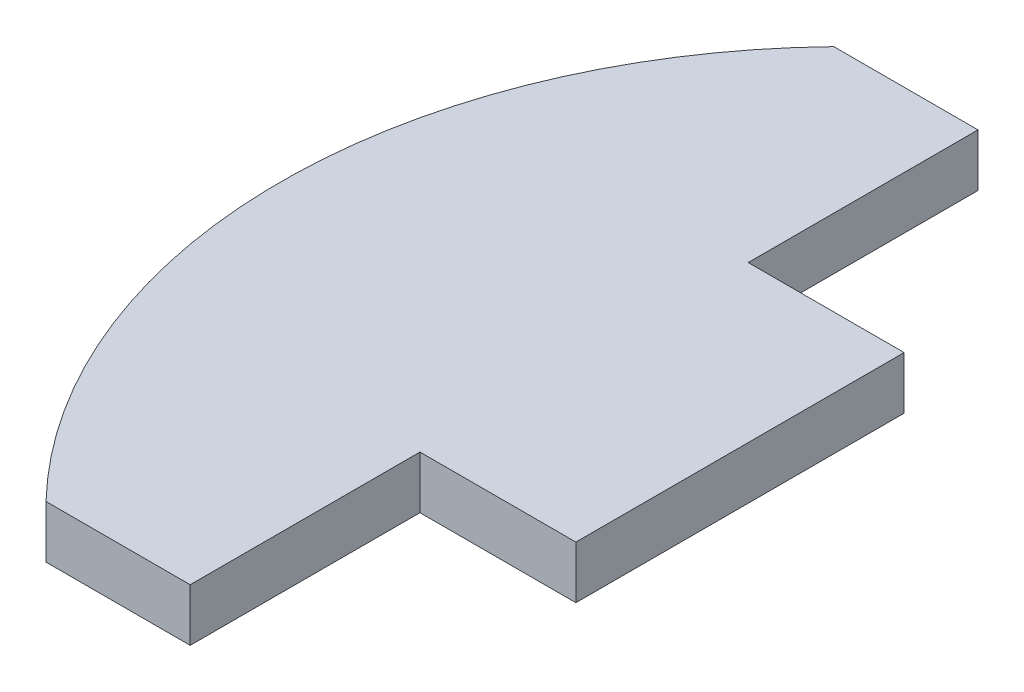
ISO-10303-21;
HEADER;
FILE_DESCRIPTION(('STEP AP214'),'2;1');
FILE_NAME('part.step','',(''),(''),'','','');
FILE_SCHEMA(('AUTOMOTIVE_DESIGN { 1 0 10303 214 1 1 1 1 }'));
ENDSEC;
DATA;
#1=APPLICATION_CONTEXT('core data for automotive mechanical design processes');
#2=APPLICATION_PROTOCOL_DEFINITION('international standard','automotive_design',2000,#1);
#3=PRODUCT_CONTEXT('',#1,'mechanical');
#4=PRODUCT('Part','Part','',(#3));
#5=PRODUCT_RELATED_PRODUCT_CATEGORY('part','',(#4));
#6=PRODUCT_DEFINITION_FORMATION('','',#4);
#7=PRODUCT_DEFINITION_CONTEXT('part definition',#1,'design');
#8=PRODUCT_DEFINITION('design','',#6,#7);
#9=PRODUCT_DEFINITION_SHAPE('','',#8);
#10=(LENGTH_UNIT() NAMED_UNIT(*) SI_UNIT(.MILLI.,.METRE.));
#11=(NAMED_UNIT(*) PLANE_ANGLE_UNIT() SI_UNIT($,.RADIAN.));
#12=(NAMED_UNIT(*) SI_UNIT($,.STERADIAN.) SOLID_ANGLE_UNIT());
#13=UNCERTAINTY_MEASURE_WITH_UNIT(LENGTH_MEASURE(1.E-05),#10,'distance_accuracy_value','');
#14=(GEOMETRIC_REPRESENTATION_CONTEXT(3) GLOBAL_UNCERTAINTY_ASSIGNED_CONTEXT((#13)) GLOBAL_UNIT_ASSIGNED_CONTEXT((#10,
#11,#12)) REPRESENTATION_CONTEXT('',''));
#15=CARTESIAN_POINT('',(0.,0.,0.));
#16=DIRECTION('',(0.,0.,1.));
#17=DIRECTION('',(1.,0.,0.));
#18=AXIS2_PLACEMENT_3D('',#15,#16,#17);
#19=CARTESIAN_POINT('',(-3.25,1.6,0.));
#20=DIRECTION('',(1.,0.,0.));
#21=DIRECTION('',(0.,0.,-1.));
#22=AXIS2_PLACEMENT_3D('',#19,#20,#21);
#23=PLANE('',#22);
#24=DIRECTION('',(0.,0.,1.));
#25=VECTOR('',#24,1.);
#26=CARTESIAN_POINT('',(-3.25,0.,0.));
#27=LINE('',#26,#25);
#28=CARTESIAN_POINT('',(-3.25,0.,-5.));
#29=VERTEX_POINT('',#28);
#30=CARTESIAN_POINT('',(-3.25,0.,5.));
#31=VERTEX_POINT('',#30);
#32=EDGE_CURVE('E128',#29,#31,#27,.T.);
#33=ORIENTED_EDGE('',*,*,#32,.F.);
#34=DIRECTION('',(0.,-1.,0.));
#35=VECTOR('',#34,1.);
#36=CARTESIAN_POINT('',(-3.25,1.6,-5.));
#37=LINE('',#36,#35);
#38=CARTESIAN_POINT('',(-3.25,1.6,-5.));
#39=VERTEX_POINT('',#38);
#40=EDGE_CURVE('E11',#39,#29,#37,.T.);
#41=ORIENTED_EDGE('',*,*,#40,.F.);
#42=DIRECTION('',(0.,0.,1.));
#43=VECTOR('',#42,1.);
#44=CARTESIAN_POINT('',(-3.25,1.6,0.));
#45=LINE('',#44,#43);
#46=CARTESIAN_POINT('',(-3.25,1.6,5.));
#47=VERTEX_POINT('',#46);
#48=EDGE_CURVE('E146',#39,#47,#45,.T.);
#49=ORIENTED_EDGE('',*,*,#48,.T.);
#50=DIRECTION('',(0.,-1.,0.));
#51=VECTOR('',#50,1.);
#52=CARTESIAN_POINT('',(-3.25,1.6,5.));
#53=LINE('',#52,#51);
#54=EDGE_CURVE('E86',#47,#31,#53,.T.);
#55=ORIENTED_EDGE('',*,*,#54,.T.);
#56=EDGE_LOOP('',(#33,#41,#49,#55));
#57=FACE_BOUND('',#56,.T.);
#58=ADVANCED_FACE('F35',(#57),#23,.T.);
#59=CARTESIAN_POINT('',(0.,1.6,-5.));
#60=DIRECTION('',(0.,0.,-1.));
#61=DIRECTION('',(-1.,0.,0.));
#62=AXIS2_PLACEMENT_3D('',#59,#60,#61);
#63=PLANE('',#62);
#64=DIRECTION('',(1.,0.,0.));
#65=VECTOR('',#64,1.);
#66=CARTESIAN_POINT('',(0.,0.,-5.));
#67=LINE('',#66,#65);
#68=CARTESIAN_POINT('',(-8.,0.,-5.));
#69=VERTEX_POINT('',#68);
#70=EDGE_CURVE('E131',#69,#29,#67,.T.);
#71=ORIENTED_EDGE('',*,*,#70,.F.);
#72=DIRECTION('',(0.,-1.,0.));
#73=VECTOR('',#72,1.);
#74=CARTESIAN_POINT('',(-8.,1.6,-5.));
#75=LINE('',#74,#73);
#76=CARTESIAN_POINT('',(-8.,1.6,-5.));
#77=VERTEX_POINT('',#76);
#78=EDGE_CURVE('E43',#77,#69,#75,.T.);
#79=ORIENTED_EDGE('',*,*,#78,.F.);
#80=DIRECTION('',(1.,0.,0.));
#81=VECTOR('',#80,1.);
#82=CARTESIAN_POINT('',(0.,1.6,-5.));
#83=LINE('',#82,#81);
#84=EDGE_CURVE('E172',#77,#39,#83,.T.);
#85=ORIENTED_EDGE('',*,*,#84,.T.);
#86=ORIENTED_EDGE('',*,*,#40,.T.);
#87=EDGE_LOOP('',(#71,#79,#85,#86));
#88=FACE_BOUND('',#87,.T.);
#89=ADVANCED_FACE('F163',(#88),#63,.T.);
#90=CARTESIAN_POINT('',(-8.,1.6,0.));
#91=DIRECTION('',(1.,0.,0.));
#92=DIRECTION('',(0.,0.,-1.));
#93=AXIS2_PLACEMENT_3D('',#90,#91,#92);
#94=PLANE('',#93);
#95=DIRECTION('',(0.,0.,1.));
#96=VECTOR('',#95,1.);
#97=CARTESIAN_POINT('',(-8.,0.,0.));
#98=LINE('',#97,#96);
#99=CARTESIAN_POINT('',(-8.,0.,-12.));
#100=VERTEX_POINT('',#99);
#101=EDGE_CURVE('E134',#100,#69,#98,.T.);
#102=ORIENTED_EDGE('',*,*,#101,.F.);
#103=DIRECTION('',(0.,-1.,0.));
#104=VECTOR('',#103,1.);
#105=CARTESIAN_POINT('',(-8.,1.6,-12.));
#106=LINE('',#105,#104);
#107=CARTESIAN_POINT('',(-8.,1.6,-12.));
#108=VERTEX_POINT('',#107);
#109=EDGE_CURVE('E152',#108,#100,#106,.T.);
#110=ORIENTED_EDGE('',*,*,#109,.F.);
#111=DIRECTION('',(0.,0.,1.));
#112=VECTOR('',#111,1.);
#113=CARTESIAN_POINT('',(-8.,1.6,0.));
#114=LINE('',#113,#112);
#115=EDGE_CURVE('E159',#108,#77,#114,.T.);
#116=ORIENTED_EDGE('',*,*,#115,.T.);
#117=ORIENTED_EDGE('',*,*,#78,.T.);
#118=EDGE_LOOP('',(#102,#110,#116,#117));
#119=FACE_BOUND('',#118,.T.);
#120=ADVANCED_FACE('F157',(#119),#94,.T.);
#121=CARTESIAN_POINT('',(0.,1.6,-12.));
#122=DIRECTION('',(0.,0.,-1.));
#123=DIRECTION('',(-1.,0.,0.));
#124=AXIS2_PLACEMENT_3D('',#121,#122,#123);
#125=PLANE('',#124);
#126=DIRECTION('',(1.,0.,0.));
#127=VECTOR('',#126,1.);
#128=CARTESIAN_POINT('',(0.,0.,-12.));
#129=LINE('',#128,#127);
#130=CARTESIAN_POINT('',(-12.3920337313937,0.,-12.));
#131=VERTEX_POINT('',#130);
#132=EDGE_CURVE('E137',#131,#100,#129,.T.);
#133=ORIENTED_EDGE('',*,*,#132,.F.);
#134=DIRECTION('',(0.,-1.,0.));
#135=VECTOR('',#134,1.);
#136=CARTESIAN_POINT('',(-12.3920337313937,1.6,-12.));
#137=LINE('',#136,#135);
#138=CARTESIAN_POINT('',(-12.3920337313937,1.6,-12.));
#139=VERTEX_POINT('',#138);
#140=EDGE_CURVE('E150',#139,#131,#137,.T.);
#141=ORIENTED_EDGE('',*,*,#140,.F.);
#142=DIRECTION('',(1.,0.,0.));
#143=VECTOR('',#142,1.);
#144=CARTESIAN_POINT('',(0.,1.6,-12.));
#145=LINE('',#144,#143);
#146=EDGE_CURVE('E171',#139,#108,#145,.T.);
#147=ORIENTED_EDGE('',*,*,#146,.T.);
#148=ORIENTED_EDGE('',*,*,#109,.T.);
#149=EDGE_LOOP('',(#133,#141,#147,#148));
#150=FACE_BOUND('',#149,.T.);
#151=ADVANCED_FACE('F169',(#150),#125,.T.);
#152=CARTESIAN_POINT('',(0.,1.6,0.));
#153=DIRECTION('',(0.,-1.,0.));
#154=DIRECTION('',(0.,0.,-1.));
#155=AXIS2_PLACEMENT_3D('',#152,#153,#154);
#156=CYLINDRICAL_SURFACE('',#155,17.25);
#157=CARTESIAN_POINT('',(0.,0.,0.));
#158=DIRECTION('',(0.,1.,0.));
#159=DIRECTION('',(0.,0.,1.));
#160=AXIS2_PLACEMENT_3D('',#157,#158,#159);
#161=CIRCLE('',#160,17.25);
#162=CARTESIAN_POINT('',(-12.3920337313937,0.,12.));
#163=VERTEX_POINT('',#162);
#164=EDGE_CURVE('E140',#131,#163,#161,.T.);
#165=ORIENTED_EDGE('',*,*,#164,.T.);
#166=DIRECTION('',(0.,-1.,0.));
#167=VECTOR('',#166,1.);
#168=CARTESIAN_POINT('',(-12.3920337313937,1.6,12.));
#169=LINE('',#168,#167);
#170=CARTESIAN_POINT('',(-12.3920337313937,1.6,12.));
#171=VERTEX_POINT('',#170);
#172=EDGE_CURVE('E120',#171,#163,#169,.T.);
#173=ORIENTED_EDGE('',*,*,#172,.F.);
#174=CARTESIAN_POINT('',(0.,1.6,0.));
#175=DIRECTION('',(0.,1.,0.));
#176=DIRECTION('',(0.,0.,1.));
#177=AXIS2_PLACEMENT_3D('',#174,#175,#176);
#178=CIRCLE('',#177,17.25);
#179=EDGE_CURVE('E111',#139,#171,#178,.T.);
#180=ORIENTED_EDGE('',*,*,#179,.F.);
#181=ORIENTED_EDGE('',*,*,#140,.T.);
#182=EDGE_LOOP('',(#165,#173,#180,#181));
#183=FACE_BOUND('',#182,.T.);
#184=ADVANCED_FACE('F188',(#183),#156,.T.);
#185=CARTESIAN_POINT('',(0.,1.6,12.));
#186=DIRECTION('',(0.,0.,-1.));
#187=DIRECTION('',(-1.,0.,0.));
#188=AXIS2_PLACEMENT_3D('',#185,#186,#187);
#189=PLANE('',#188);
#190=DIRECTION('',(1.,0.,0.));
#191=VECTOR('',#190,1.);
#192=CARTESIAN_POINT('',(0.,0.,12.));
#193=LINE('',#192,#191);
#194=CARTESIAN_POINT('',(-8.,0.,12.));
#195=VERTEX_POINT('',#194);
#196=EDGE_CURVE('E119',#163,#195,#193,.T.);
#197=ORIENTED_EDGE('',*,*,#196,.T.);
#198=DIRECTION('',(0.,-1.,0.));
#199=VECTOR('',#198,1.);
#200=CARTESIAN_POINT('',(-8.,1.6,12.));
#201=LINE('',#200,#199);
#202=CARTESIAN_POINT('',(-8.,1.6,12.));
#203=VERTEX_POINT('',#202);
#204=EDGE_CURVE('E116',#203,#195,#201,.T.);
#205=ORIENTED_EDGE('',*,*,#204,.F.);
#206=DIRECTION('',(1.,0.,0.));
#207=VECTOR('',#206,1.);
#208=CARTESIAN_POINT('',(0.,1.6,12.));
#209=LINE('',#208,#207);
#210=EDGE_CURVE('E104',#171,#203,#209,.T.);
#211=ORIENTED_EDGE('',*,*,#210,.F.);
#212=ORIENTED_EDGE('',*,*,#172,.T.);
#213=EDGE_LOOP('',(#197,#205,#211,#212));
#214=FACE_BOUND('',#213,.T.);
#215=ADVANCED_FACE('F117',(#214),#189,.F.);
#216=CARTESIAN_POINT('',(-8.,1.6,0.));
#217=DIRECTION('',(-1.,0.,0.));
#218=DIRECTION('',(0.,0.,1.));
#219=AXIS2_PLACEMENT_3D('',#216,#217,#218);
#220=PLANE('',#219);
#221=DIRECTION('',(0.,0.,-1.));
#222=VECTOR('',#221,1.);
#223=CARTESIAN_POINT('',(-8.,0.,0.));
#224=LINE('',#223,#222);
#225=CARTESIAN_POINT('',(-8.,0.,5.));
#226=VERTEX_POINT('',#225);
#227=EDGE_CURVE('E79',#195,#226,#224,.T.);
#228=ORIENTED_EDGE('',*,*,#227,.T.);
#229=DIRECTION('',(0.,-1.,0.));
#230=VECTOR('',#229,1.);
#231=CARTESIAN_POINT('',(-8.,1.6,5.));
#232=LINE('',#231,#230);
#233=CARTESIAN_POINT('',(-8.,1.6,5.));
#234=VERTEX_POINT('',#233);
#235=EDGE_CURVE('E121',#234,#226,#232,.T.);
#236=ORIENTED_EDGE('',*,*,#235,.F.);
#237=DIRECTION('',(0.,0.,-1.));
#238=VECTOR('',#237,1.);
#239=CARTESIAN_POINT('',(-8.,1.6,0.));
#240=LINE('',#239,#238);
#241=EDGE_CURVE('E108',#203,#234,#240,.T.);
#242=ORIENTED_EDGE('',*,*,#241,.F.);
#243=ORIENTED_EDGE('',*,*,#204,.T.);
#244=EDGE_LOOP('',(#228,#236,#242,#243));
#245=FACE_BOUND('',#244,.T.);
#246=ADVANCED_FACE('F123',(#245),#220,.F.);
#247=CARTESIAN_POINT('',(0.,1.6,5.));
#248=DIRECTION('',(0.,0.,-1.));
#249=DIRECTION('',(-1.,0.,0.));
#250=AXIS2_PLACEMENT_3D('',#247,#248,#249);
#251=PLANE('',#250);
#252=DIRECTION('',(1.,0.,0.));
#253=VECTOR('',#252,1.);
#254=CARTESIAN_POINT('',(0.,0.,5.));
#255=LINE('',#254,#253);
#256=EDGE_CURVE('E144',#226,#31,#255,.T.);
#257=ORIENTED_EDGE('',*,*,#256,.T.);
#258=ORIENTED_EDGE('',*,*,#54,.F.);
#259=DIRECTION('',(1.,0.,0.));
#260=VECTOR('',#259,1.);
#261=CARTESIAN_POINT('',(0.,1.6,5.));
#262=LINE('',#261,#260);
#263=EDGE_CURVE('E51',#234,#47,#262,.T.);
#264=ORIENTED_EDGE('',*,*,#263,.F.);
#265=ORIENTED_EDGE('',*,*,#235,.T.);
#266=EDGE_LOOP('',(#257,#258,#264,#265));
#267=FACE_BOUND('',#266,.T.);
#268=ADVANCED_FACE('F196',(#267),#251,.F.);
#269=CARTESIAN_POINT('',(0.,1.6,0.));
#270=DIRECTION('',(0.,1.,0.));
#271=DIRECTION('',(0.,0.,1.));
#272=AXIS2_PLACEMENT_3D('',#269,#270,#271);
#273=PLANE('',#272);
#274=ORIENTED_EDGE('',*,*,#48,.F.);
#275=ORIENTED_EDGE('',*,*,#84,.F.);
#276=ORIENTED_EDGE('',*,*,#115,.F.);
#277=ORIENTED_EDGE('',*,*,#146,.F.);
#278=ORIENTED_EDGE('',*,*,#179,.T.);
#279=ORIENTED_EDGE('',*,*,#210,.T.);
#280=ORIENTED_EDGE('',*,*,#241,.T.);
#281=ORIENTED_EDGE('',*,*,#263,.T.);
#282=EDGE_LOOP('',(#274,#275,#276,#277,#278,#279,#280,#281));
#283=FACE_BOUND('',#282,.T.);
#284=ADVANCED_FACE('F106',(#283),#273,.T.);
#285=CARTESIAN_POINT('',(0.,0.,0.));
#286=DIRECTION('',(0.,1.,0.));
#287=DIRECTION('',(0.,0.,1.));
#288=AXIS2_PLACEMENT_3D('',#285,#286,#287);
#289=PLANE('',#288);
#290=ORIENTED_EDGE('',*,*,#32,.T.);
#291=ORIENTED_EDGE('',*,*,#256,.F.);
#292=ORIENTED_EDGE('',*,*,#227,.F.);
#293=ORIENTED_EDGE('',*,*,#196,.F.);
#294=ORIENTED_EDGE('',*,*,#164,.F.);
#295=ORIENTED_EDGE('',*,*,#132,.T.);
#296=ORIENTED_EDGE('',*,*,#101,.T.);
#297=ORIENTED_EDGE('',*,*,#70,.T.);
#298=EDGE_LOOP('',(#290,#291,#292,#293,#294,#295,#296,#297));
#299=FACE_BOUND('',#298,.T.);
#300=ADVANCED_FACE('F165',(#299),#289,.F.);
#301=CLOSED_SHELL('',(#58,#89,#120,#151,#184,#215,#246,#268,#284,#300));
#302=MANIFOLD_SOLID_BREP('B2',#301);
#303=ADVANCED_BREP_SHAPE_REPRESENTATION('',(#18,#302),#14);
#304=SHAPE_DEFINITION_REPRESENTATION(#9,#303);
ENDSEC;
END-ISO-10303-21;
